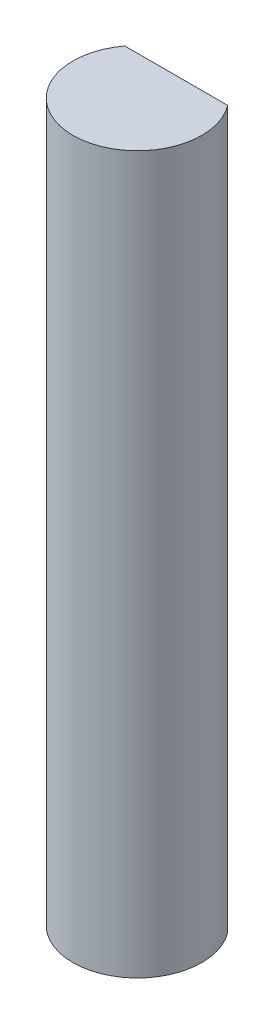
ISO-10303-21;
HEADER;
FILE_DESCRIPTION(('STEP AP214'),'2;1');
FILE_NAME('part.step','',(''),(''),'','','');
FILE_SCHEMA(('AUTOMOTIVE_DESIGN { 1 0 10303 214 1 1 1 1 }'));
ENDSEC;
DATA;
#1=APPLICATION_CONTEXT('core data for automotive mechanical design processes');
#2=APPLICATION_PROTOCOL_DEFINITION('international standard','automotive_design',2000,#1);
#3=PRODUCT_CONTEXT('',#1,'mechanical');
#4=PRODUCT('Part','Part','',(#3));
#5=PRODUCT_RELATED_PRODUCT_CATEGORY('part','',(#4));
#6=PRODUCT_DEFINITION_FORMATION('','',#4);
#7=PRODUCT_DEFINITION_CONTEXT('part definition',#1,'design');
#8=PRODUCT_DEFINITION('design','',#6,#7);
#9=PRODUCT_DEFINITION_SHAPE('','',#8);
#10=(LENGTH_UNIT() NAMED_UNIT(*) SI_UNIT(.MILLI.,.METRE.));
#11=(NAMED_UNIT(*) PLANE_ANGLE_UNIT() SI_UNIT($,.RADIAN.));
#12=(NAMED_UNIT(*) SI_UNIT($,.STERADIAN.) SOLID_ANGLE_UNIT());
#13=UNCERTAINTY_MEASURE_WITH_UNIT(LENGTH_MEASURE(1.E-05),#10,'distance_accuracy_value','');
#14=(GEOMETRIC_REPRESENTATION_CONTEXT(3) GLOBAL_UNCERTAINTY_ASSIGNED_CONTEXT((#13)) GLOBAL_UNIT_ASSIGNED_CONTEXT((#10,
#11,#12)) REPRESENTATION_CONTEXT('',''));
#15=CARTESIAN_POINT('',(0.,0.,0.));
#16=DIRECTION('',(0.,0.,1.));
#17=DIRECTION('',(1.,0.,0.));
#18=AXIS2_PLACEMENT_3D('',#15,#16,#17);
#19=CARTESIAN_POINT('',(0.,17.5,0.));
#20=DIRECTION('',(0.,-1.,0.));
#21=DIRECTION('',(0.,0.,-1.));
#22=AXIS2_PLACEMENT_3D('',#19,#20,#21);
#23=CYLINDRICAL_SURFACE('',#22,3.15);
#24=CARTESIAN_POINT('',(0.,17.5,0.));
#25=DIRECTION('',(0.,1.,0.));
#26=DIRECTION('',(0.,0.,1.));
#27=AXIS2_PLACEMENT_3D('',#24,#25,#26);
#28=CIRCLE('',#27,3.15);
#29=CARTESIAN_POINT('',(-2.51246890528022,17.5,-1.9));
#30=VERTEX_POINT('',#29);
#31=CARTESIAN_POINT('',(2.51246890528022,17.5,-1.9));
#32=VERTEX_POINT('',#31);
#33=EDGE_CURVE('E11',#30,#32,#28,.T.);
#34=ORIENTED_EDGE('',*,*,#33,.F.);
#35=DIRECTION('',(0.,1.,0.));
#36=VECTOR('',#35,1.);
#37=CARTESIAN_POINT('',(-2.51246890528022,-22.7440442408508,-1.9));
#38=LINE('',#37,#36);
#39=CARTESIAN_POINT('',(-2.51246890528022,-17.5,-1.9));
#40=VERTEX_POINT('',#39);
#41=EDGE_CURVE('E56',#40,#30,#38,.T.);
#42=ORIENTED_EDGE('',*,*,#41,.F.);
#43=CARTESIAN_POINT('',(0.,-17.5,0.));
#44=DIRECTION('',(0.,1.,0.));
#45=DIRECTION('',(0.,0.,1.));
#46=AXIS2_PLACEMENT_3D('',#43,#44,#45);
#47=CIRCLE('',#46,3.15);
#48=CARTESIAN_POINT('',(2.51246890528022,-17.5,-1.9));
#49=VERTEX_POINT('',#48);
#50=EDGE_CURVE('E36',#40,#49,#47,.T.);
#51=ORIENTED_EDGE('',*,*,#50,.T.);
#52=DIRECTION('',(0.,1.,0.));
#53=VECTOR('',#52,1.);
#54=CARTESIAN_POINT('',(2.51246890528022,-22.7440442408508,-1.9));
#55=LINE('',#54,#53);
#56=EDGE_CURVE('E47',#49,#32,#55,.T.);
#57=ORIENTED_EDGE('',*,*,#56,.T.);
#58=EDGE_LOOP('',(#34,#42,#51,#57));
#59=FACE_BOUND('',#58,.T.);
#60=ADVANCED_FACE('F33',(#59),#23,.T.);
#61=CARTESIAN_POINT('',(0.,17.5,0.));
#62=DIRECTION('',(0.,1.,0.));
#63=DIRECTION('',(0.,0.,1.));
#64=AXIS2_PLACEMENT_3D('',#61,#62,#63);
#65=PLANE('',#64);
#66=DIRECTION('',(1.,0.,0.));
#67=VECTOR('',#66,1.);
#68=CARTESIAN_POINT('',(-2.51246890528022,17.5,-1.9));
#69=LINE('',#68,#67);
#70=EDGE_CURVE('E59',#30,#32,#69,.T.);
#71=ORIENTED_EDGE('',*,*,#70,.F.);
#72=ORIENTED_EDGE('',*,*,#33,.T.);
#73=EDGE_LOOP('',(#71,#72));
#74=FACE_BOUND('',#73,.T.);
#75=ADVANCED_FACE('F66',(#74),#65,.T.);
#76=CARTESIAN_POINT('',(0.,-17.5,0.));
#77=DIRECTION('',(0.,1.,0.));
#78=DIRECTION('',(0.,0.,1.));
#79=AXIS2_PLACEMENT_3D('',#76,#77,#78);
#80=PLANE('',#79);
#81=ORIENTED_EDGE('',*,*,#50,.F.);
#82=DIRECTION('',(-1.,0.,0.));
#83=VECTOR('',#82,1.);
#84=CARTESIAN_POINT('',(-2.51246890528022,-17.5,-1.9));
#85=LINE('',#84,#83);
#86=EDGE_CURVE('E51',#49,#40,#85,.T.);
#87=ORIENTED_EDGE('',*,*,#86,.F.);
#88=EDGE_LOOP('',(#81,#87));
#89=FACE_BOUND('',#88,.T.);
#90=ADVANCED_FACE('F71',(#89),#80,.F.);
#91=CARTESIAN_POINT('',(-2.51246890528022,-22.7440442408508,-1.9));
#92=DIRECTION('',(0.,0.,1.));
#93=DIRECTION('',(1.,0.,0.));
#94=AXIS2_PLACEMENT_3D('',#91,#92,#93);
#95=PLANE('',#94);
#96=ORIENTED_EDGE('',*,*,#86,.T.);
#97=ORIENTED_EDGE('',*,*,#41,.T.);
#98=ORIENTED_EDGE('',*,*,#70,.T.);
#99=ORIENTED_EDGE('',*,*,#56,.F.);
#100=EDGE_LOOP('',(#96,#97,#98,#99));
#101=FACE_BOUND('',#100,.T.);
#102=ADVANCED_FACE('F58',(#101),#95,.F.);
#103=CLOSED_SHELL('',(#60,#75,#90,#102));
#104=MANIFOLD_SOLID_BREP('B2',#103);
#105=ADVANCED_BREP_SHAPE_REPRESENTATION('',(#18,#104),#14);
#106=SHAPE_DEFINITION_REPRESENTATION(#9,#105);
ENDSEC;
END-ISO-10303-21;
